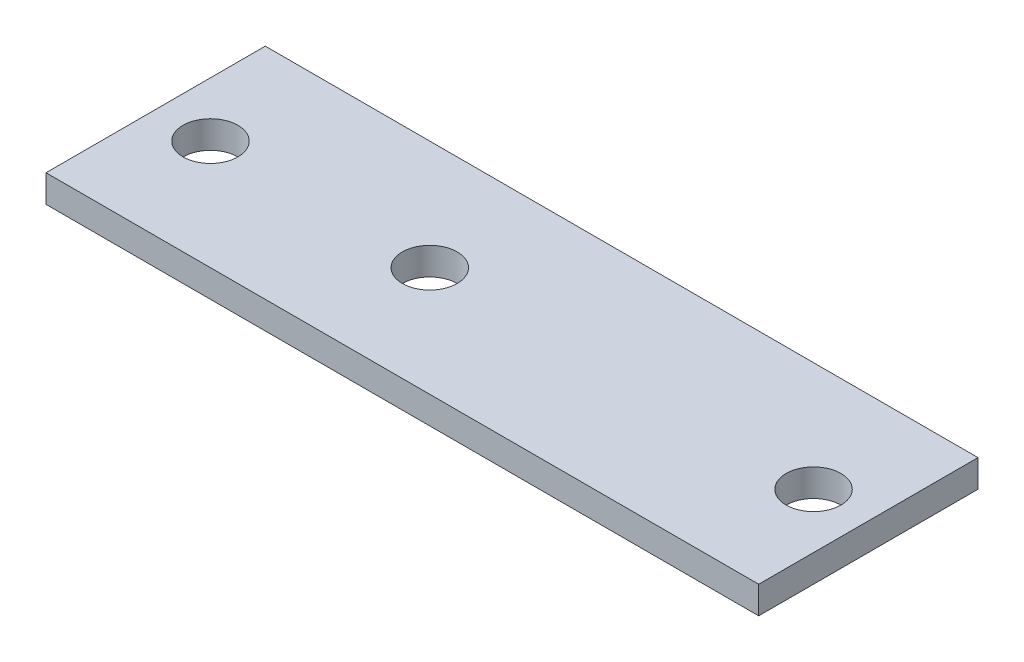
ISO-10303-21;
HEADER;
FILE_DESCRIPTION(('STEP AP214'),'2;1');
FILE_NAME('part.step','',(''),(''),'','','');
FILE_SCHEMA(('AUTOMOTIVE_DESIGN { 1 0 10303 214 1 1 1 1 }'));
ENDSEC;
DATA;
#1=APPLICATION_CONTEXT('core data for automotive mechanical design processes');
#2=APPLICATION_PROTOCOL_DEFINITION('international standard','automotive_design',2000,#1);
#3=PRODUCT_CONTEXT('',#1,'mechanical');
#4=PRODUCT('Part','Part','',(#3));
#5=PRODUCT_RELATED_PRODUCT_CATEGORY('part','',(#4));
#6=PRODUCT_DEFINITION_FORMATION('','',#4);
#7=PRODUCT_DEFINITION_CONTEXT('part definition',#1,'design');
#8=PRODUCT_DEFINITION('design','',#6,#7);
#9=PRODUCT_DEFINITION_SHAPE('','',#8);
#10=(LENGTH_UNIT() NAMED_UNIT(*) SI_UNIT(.MILLI.,.METRE.));
#11=(NAMED_UNIT(*) PLANE_ANGLE_UNIT() SI_UNIT($,.RADIAN.));
#12=(NAMED_UNIT(*) SI_UNIT($,.STERADIAN.) SOLID_ANGLE_UNIT());
#13=UNCERTAINTY_MEASURE_WITH_UNIT(LENGTH_MEASURE(1.E-05),#10,'distance_accuracy_value','');
#14=(GEOMETRIC_REPRESENTATION_CONTEXT(3) GLOBAL_UNCERTAINTY_ASSIGNED_CONTEXT((#13)) GLOBAL_UNIT_ASSIGNED_CONTEXT((#10,
#11,#12)) REPRESENTATION_CONTEXT('',''));
#15=CARTESIAN_POINT('',(0.,0.,0.));
#16=DIRECTION('',(0.,0.,1.));
#17=DIRECTION('',(1.,0.,0.));
#18=AXIS2_PLACEMENT_3D('',#15,#16,#17);
#19=CARTESIAN_POINT('',(0.,3.175,-25.4));
#20=DIRECTION('',(0.,0.,-1.));
#21=DIRECTION('',(-1.,0.,0.));
#22=AXIS2_PLACEMENT_3D('',#19,#20,#21);
#23=PLANE('',#22);
#24=DIRECTION('',(1.,0.,0.));
#25=VECTOR('',#24,1.);
#26=CARTESIAN_POINT('',(0.,0.,-25.4));
#27=LINE('',#26,#25);
#28=CARTESIAN_POINT('',(0.,0.,-25.4));
#29=VERTEX_POINT('',#28);
#30=CARTESIAN_POINT('',(82.55,0.,-25.4));
#31=VERTEX_POINT('',#30);
#32=EDGE_CURVE('E112',#29,#31,#27,.T.);
#33=ORIENTED_EDGE('',*,*,#32,.F.);
#34=DIRECTION('',(0.,-1.,0.));
#35=VECTOR('',#34,1.);
#36=CARTESIAN_POINT('',(0.,3.175,-25.4));
#37=LINE('',#36,#35);
#38=CARTESIAN_POINT('',(0.,3.175,-25.4));
#39=VERTEX_POINT('',#38);
#40=EDGE_CURVE('E11',#39,#29,#37,.T.);
#41=ORIENTED_EDGE('',*,*,#40,.F.);
#42=DIRECTION('',(1.,0.,0.));
#43=VECTOR('',#42,1.);
#44=CARTESIAN_POINT('',(0.,3.175,-25.4));
#45=LINE('',#44,#43);
#46=CARTESIAN_POINT('',(82.55,3.175,-25.4));
#47=VERTEX_POINT('',#46);
#48=EDGE_CURVE('E96',#39,#47,#45,.T.);
#49=ORIENTED_EDGE('',*,*,#48,.T.);
#50=DIRECTION('',(0.,-1.,0.));
#51=VECTOR('',#50,1.);
#52=CARTESIAN_POINT('',(82.55,3.175,-25.4));
#53=LINE('',#52,#51);
#54=EDGE_CURVE('E75',#47,#31,#53,.T.);
#55=ORIENTED_EDGE('',*,*,#54,.T.);
#56=EDGE_LOOP('',(#33,#41,#49,#55));
#57=FACE_BOUND('',#56,.T.);
#58=ADVANCED_FACE('F35',(#57),#23,.T.);
#59=CARTESIAN_POINT('',(0.,3.175,0.));
#60=DIRECTION('',(-1.,0.,0.));
#61=DIRECTION('',(0.,0.,1.));
#62=AXIS2_PLACEMENT_3D('',#59,#60,#61);
#63=PLANE('',#62);
#64=DIRECTION('',(0.,0.,-1.));
#65=VECTOR('',#64,1.);
#66=CARTESIAN_POINT('',(0.,0.,0.));
#67=LINE('',#66,#65);
#68=CARTESIAN_POINT('',(0.,0.,0.));
#69=VERTEX_POINT('',#68);
#70=EDGE_CURVE('E87',#69,#29,#67,.T.);
#71=ORIENTED_EDGE('',*,*,#70,.F.);
#72=DIRECTION('',(0.,-1.,0.));
#73=VECTOR('',#72,1.);
#74=CARTESIAN_POINT('',(0.,3.175,0.));
#75=LINE('',#74,#73);
#76=CARTESIAN_POINT('',(0.,3.175,0.));
#77=VERTEX_POINT('',#76);
#78=EDGE_CURVE('E44',#77,#69,#75,.T.);
#79=ORIENTED_EDGE('',*,*,#78,.F.);
#80=DIRECTION('',(0.,0.,-1.));
#81=VECTOR('',#80,1.);
#82=CARTESIAN_POINT('',(0.,3.175,0.));
#83=LINE('',#82,#81);
#84=EDGE_CURVE('E85',#77,#39,#83,.T.);
#85=ORIENTED_EDGE('',*,*,#84,.T.);
#86=ORIENTED_EDGE('',*,*,#40,.T.);
#87=EDGE_LOOP('',(#71,#79,#85,#86));
#88=FACE_BOUND('',#87,.T.);
#89=ADVANCED_FACE('F83',(#88),#63,.T.);
#90=CARTESIAN_POINT('',(0.,3.175,0.));
#91=DIRECTION('',(0.,0.,-1.));
#92=DIRECTION('',(-1.,0.,0.));
#93=AXIS2_PLACEMENT_3D('',#90,#91,#92);
#94=PLANE('',#93);
#95=DIRECTION('',(1.,0.,0.));
#96=VECTOR('',#95,1.);
#97=CARTESIAN_POINT('',(0.,0.,0.));
#98=LINE('',#97,#96);
#99=CARTESIAN_POINT('',(82.55,0.,0.));
#100=VERTEX_POINT('',#99);
#101=EDGE_CURVE('E115',#69,#100,#98,.T.);
#102=ORIENTED_EDGE('',*,*,#101,.T.);
#103=DIRECTION('',(0.,-1.,0.));
#104=VECTOR('',#103,1.);
#105=CARTESIAN_POINT('',(82.55,3.175,0.));
#106=LINE('',#105,#104);
#107=CARTESIAN_POINT('',(82.55,3.175,0.));
#108=VERTEX_POINT('',#107);
#109=EDGE_CURVE('E90',#108,#100,#106,.T.);
#110=ORIENTED_EDGE('',*,*,#109,.F.);
#111=DIRECTION('',(1.,0.,0.));
#112=VECTOR('',#111,1.);
#113=CARTESIAN_POINT('',(0.,3.175,0.));
#114=LINE('',#113,#112);
#115=EDGE_CURVE('E92',#77,#108,#114,.T.);
#116=ORIENTED_EDGE('',*,*,#115,.F.);
#117=ORIENTED_EDGE('',*,*,#78,.T.);
#118=EDGE_LOOP('',(#102,#110,#116,#117));
#119=FACE_BOUND('',#118,.T.);
#120=ADVANCED_FACE('F93',(#119),#94,.F.);
#121=CARTESIAN_POINT('',(6.35,3.175,-12.7));
#122=DIRECTION('',(0.,-1.,0.));
#123=DIRECTION('',(0.,0.,-1.));
#124=AXIS2_PLACEMENT_3D('',#121,#122,#123);
#125=CYLINDRICAL_SURFACE('',#124,3.175);
#126=CARTESIAN_POINT('',(6.35,3.175,-12.7));
#127=DIRECTION('',(0.,1.,0.));
#128=DIRECTION('',(0.,0.,1.));
#129=AXIS2_PLACEMENT_3D('',#126,#127,#128);
#130=CIRCLE('',#129,3.175);
#131=CARTESIAN_POINT('',(6.35,3.175,-9.525));
#132=VERTEX_POINT('',#131);
#133=EDGE_CURVE('E98',#132,#132,#130,.T.);
#134=ORIENTED_EDGE('',*,*,#133,.T.);
#135=EDGE_LOOP('',(#134));
#136=FACE_BOUND('',#135,.T.);
#137=CARTESIAN_POINT('',(6.35,0.,-12.7));
#138=DIRECTION('',(0.,1.,0.));
#139=DIRECTION('',(0.,0.,1.));
#140=AXIS2_PLACEMENT_3D('',#137,#138,#139);
#141=CIRCLE('',#140,3.175);
#142=CARTESIAN_POINT('',(6.35,0.,-9.525));
#143=VERTEX_POINT('',#142);
#144=EDGE_CURVE('E109',#143,#143,#141,.T.);
#145=ORIENTED_EDGE('',*,*,#144,.F.);
#146=EDGE_LOOP('',(#145));
#147=FACE_BOUND('',#146,.T.);
#148=ADVANCED_FACE('F131',(#136,#147),#125,.F.);
#149=CARTESIAN_POINT('',(31.75,3.175,-12.7));
#150=DIRECTION('',(0.,-1.,0.));
#151=DIRECTION('',(0.,0.,-1.));
#152=AXIS2_PLACEMENT_3D('',#149,#150,#151);
#153=CYLINDRICAL_SURFACE('',#152,3.175);
#154=CARTESIAN_POINT('',(31.75,3.175,-12.7));
#155=DIRECTION('',(0.,1.,0.));
#156=DIRECTION('',(0.,0.,1.));
#157=AXIS2_PLACEMENT_3D('',#154,#155,#156);
#158=CIRCLE('',#157,3.175);
#159=CARTESIAN_POINT('',(31.75,3.175,-9.525));
#160=VERTEX_POINT('',#159);
#161=EDGE_CURVE('E144',#160,#160,#158,.T.);
#162=ORIENTED_EDGE('',*,*,#161,.T.);
#163=EDGE_LOOP('',(#162));
#164=FACE_BOUND('',#163,.T.);
#165=CARTESIAN_POINT('',(31.75,0.,-12.7));
#166=DIRECTION('',(0.,1.,0.));
#167=DIRECTION('',(0.,0.,1.));
#168=AXIS2_PLACEMENT_3D('',#165,#166,#167);
#169=CIRCLE('',#168,3.175);
#170=CARTESIAN_POINT('',(31.75,0.,-9.525));
#171=VERTEX_POINT('',#170);
#172=EDGE_CURVE('E106',#171,#171,#169,.T.);
#173=ORIENTED_EDGE('',*,*,#172,.F.);
#174=EDGE_LOOP('',(#173));
#175=FACE_BOUND('',#174,.T.);
#176=ADVANCED_FACE('F133',(#164,#175),#153,.F.);
#177=CARTESIAN_POINT('',(76.2,3.175,-12.7));
#178=DIRECTION('',(0.,-1.,0.));
#179=DIRECTION('',(0.,0.,-1.));
#180=AXIS2_PLACEMENT_3D('',#177,#178,#179);
#181=CYLINDRICAL_SURFACE('',#180,3.175);
#182=CARTESIAN_POINT('',(76.2,3.175,-12.7));
#183=DIRECTION('',(0.,1.,0.));
#184=DIRECTION('',(0.,0.,1.));
#185=AXIS2_PLACEMENT_3D('',#182,#183,#184);
#186=CIRCLE('',#185,3.175);
#187=CARTESIAN_POINT('',(76.2,3.175,-9.525));
#188=VERTEX_POINT('',#187);
#189=EDGE_CURVE('E118',#188,#188,#186,.T.);
#190=ORIENTED_EDGE('',*,*,#189,.T.);
#191=EDGE_LOOP('',(#190));
#192=FACE_BOUND('',#191,.T.);
#193=CARTESIAN_POINT('',(76.2,0.,-12.7));
#194=DIRECTION('',(0.,1.,0.));
#195=DIRECTION('',(0.,0.,1.));
#196=AXIS2_PLACEMENT_3D('',#193,#194,#195);
#197=CIRCLE('',#196,3.175);
#198=CARTESIAN_POINT('',(76.2,0.,-9.525));
#199=VERTEX_POINT('',#198);
#200=EDGE_CURVE('E103',#199,#199,#197,.T.);
#201=ORIENTED_EDGE('',*,*,#200,.F.);
#202=EDGE_LOOP('',(#201));
#203=FACE_BOUND('',#202,.T.);
#204=ADVANCED_FACE('F37',(#192,#203),#181,.F.);
#205=CARTESIAN_POINT('',(82.55,3.175,0.));
#206=DIRECTION('',(-1.,0.,0.));
#207=DIRECTION('',(0.,0.,1.));
#208=AXIS2_PLACEMENT_3D('',#205,#206,#207);
#209=PLANE('',#208);
#210=DIRECTION('',(0.,0.,-1.));
#211=VECTOR('',#210,1.);
#212=CARTESIAN_POINT('',(82.55,0.,0.));
#213=LINE('',#212,#211);
#214=EDGE_CURVE('E68',#100,#31,#213,.T.);
#215=ORIENTED_EDGE('',*,*,#214,.T.);
#216=ORIENTED_EDGE('',*,*,#54,.F.);
#217=DIRECTION('',(0.,0.,-1.));
#218=VECTOR('',#217,1.);
#219=CARTESIAN_POINT('',(82.55,3.175,0.));
#220=LINE('',#219,#218);
#221=EDGE_CURVE('E52',#108,#47,#220,.T.);
#222=ORIENTED_EDGE('',*,*,#221,.F.);
#223=ORIENTED_EDGE('',*,*,#109,.T.);
#224=EDGE_LOOP('',(#215,#216,#222,#223));
#225=FACE_BOUND('',#224,.T.);
#226=ADVANCED_FACE('F121',(#225),#209,.F.);
#227=CARTESIAN_POINT('',(0.,3.175,0.));
#228=DIRECTION('',(0.,1.,0.));
#229=DIRECTION('',(0.,0.,1.));
#230=AXIS2_PLACEMENT_3D('',#227,#228,#229);
#231=PLANE('',#230);
#232=ORIENTED_EDGE('',*,*,#189,.F.);
#233=EDGE_LOOP('',(#232));
#234=FACE_BOUND('',#233,.T.);
#235=ORIENTED_EDGE('',*,*,#161,.F.);
#236=EDGE_LOOP('',(#235));
#237=FACE_BOUND('',#236,.T.);
#238=ORIENTED_EDGE('',*,*,#133,.F.);
#239=EDGE_LOOP('',(#238));
#240=FACE_BOUND('',#239,.T.);
#241=ORIENTED_EDGE('',*,*,#48,.F.);
#242=ORIENTED_EDGE('',*,*,#84,.F.);
#243=ORIENTED_EDGE('',*,*,#115,.T.);
#244=ORIENTED_EDGE('',*,*,#221,.T.);
#245=EDGE_LOOP('',(#241,#242,#243,#244));
#246=FACE_BOUND('',#245,.T.);
#247=ADVANCED_FACE('F95',(#234,#237,#240,#246),#231,.T.);
#248=CARTESIAN_POINT('',(0.,0.,0.));
#249=DIRECTION('',(0.,1.,0.));
#250=DIRECTION('',(0.,0.,1.));
#251=AXIS2_PLACEMENT_3D('',#248,#249,#250);
#252=PLANE('',#251);
#253=ORIENTED_EDGE('',*,*,#200,.T.);
#254=EDGE_LOOP('',(#253));
#255=FACE_BOUND('',#254,.T.);
#256=ORIENTED_EDGE('',*,*,#172,.T.);
#257=EDGE_LOOP('',(#256));
#258=FACE_BOUND('',#257,.T.);
#259=ORIENTED_EDGE('',*,*,#144,.T.);
#260=EDGE_LOOP('',(#259));
#261=FACE_BOUND('',#260,.T.);
#262=ORIENTED_EDGE('',*,*,#32,.T.);
#263=ORIENTED_EDGE('',*,*,#214,.F.);
#264=ORIENTED_EDGE('',*,*,#101,.F.);
#265=ORIENTED_EDGE('',*,*,#70,.T.);
#266=EDGE_LOOP('',(#262,#263,#264,#265));
#267=FACE_BOUND('',#266,.T.);
#268=ADVANCED_FACE('F122',(#255,#258,#261,#267),#252,.F.);
#269=CLOSED_SHELL('',(#58,#89,#120,#148,#176,#204,#226,#247,#268));
#270=MANIFOLD_SOLID_BREP('B2',#269);
#271=ADVANCED_BREP_SHAPE_REPRESENTATION('',(#18,#270),#14);
#272=SHAPE_DEFINITION_REPRESENTATION(#9,#271);
ENDSEC;
END-ISO-10303-21;
